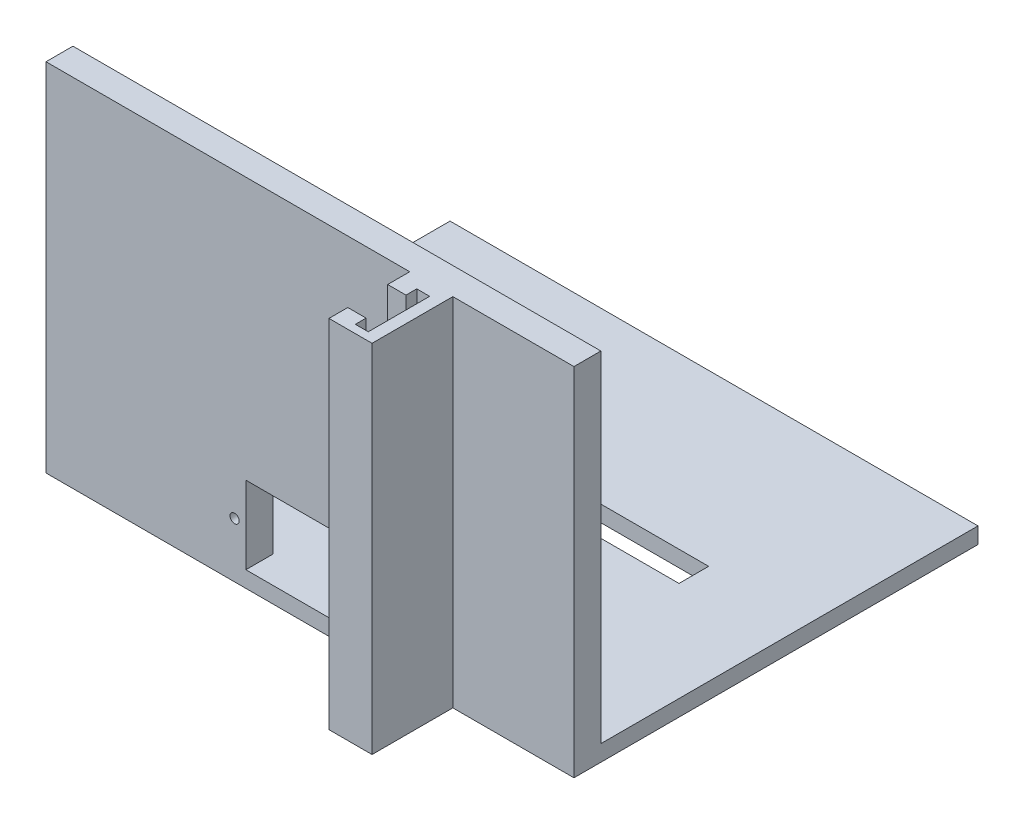
ISO-10303-21;
HEADER;
FILE_DESCRIPTION(('STEP AP214'),'2;1');
FILE_NAME('part.step','',(''),(''),'','','');
FILE_SCHEMA(('AUTOMOTIVE_DESIGN { 1 0 10303 214 1 1 1 1 }'));
ENDSEC;
DATA;
#1=APPLICATION_CONTEXT('core data for automotive mechanical design processes');
#2=APPLICATION_PROTOCOL_DEFINITION('international standard','automotive_design',2000,#1);
#3=PRODUCT_CONTEXT('',#1,'mechanical');
#4=PRODUCT('Part','Part','',(#3));
#5=PRODUCT_RELATED_PRODUCT_CATEGORY('part','',(#4));
#6=PRODUCT_DEFINITION_FORMATION('','',#4);
#7=PRODUCT_DEFINITION_CONTEXT('part definition',#1,'design');
#8=PRODUCT_DEFINITION('design','',#6,#7);
#9=PRODUCT_DEFINITION_SHAPE('','',#8);
#10=(LENGTH_UNIT() NAMED_UNIT(*) SI_UNIT(.MILLI.,.METRE.));
#11=(NAMED_UNIT(*) PLANE_ANGLE_UNIT() SI_UNIT($,.RADIAN.));
#12=(NAMED_UNIT(*) SI_UNIT($,.STERADIAN.) SOLID_ANGLE_UNIT());
#13=UNCERTAINTY_MEASURE_WITH_UNIT(LENGTH_MEASURE(1.E-05),#10,'distance_accuracy_value','');
#14=(GEOMETRIC_REPRESENTATION_CONTEXT(3) GLOBAL_UNCERTAINTY_ASSIGNED_CONTEXT((#13)) GLOBAL_UNIT_ASSIGNED_CONTEXT((#10,
#11,#12)) REPRESENTATION_CONTEXT('',''));
#15=CARTESIAN_POINT('',(0.,0.,0.));
#16=DIRECTION('',(0.,0.,1.));
#17=DIRECTION('',(1.,0.,0.));
#18=AXIS2_PLACEMENT_3D('',#15,#16,#17);
#19=CARTESIAN_POINT('',(0.,0.,5.));
#20=DIRECTION('',(0.,0.,1.));
#21=DIRECTION('',(1.,0.,0.));
#22=AXIS2_PLACEMENT_3D('',#19,#20,#21);
#23=PLANE('',#22);
#24=DIRECTION('',(0.,1.,0.));
#25=VECTOR('',#24,1.);
#26=CARTESIAN_POINT('',(26.52,55.9146124543355,5.));
#27=LINE('',#26,#25);
#28=CARTESIAN_POINT('',(26.52,-10.2,5.));
#29=VERTEX_POINT('',#28);
#30=CARTESIAN_POINT('',(26.52,55.9146124543355,5.));
#31=VERTEX_POINT('',#30);
#32=EDGE_CURVE('E47',#29,#31,#27,.T.);
#33=ORIENTED_EDGE('',*,*,#32,.F.);
#34=DIRECTION('',(1.,0.,0.));
#35=VECTOR('',#34,1.);
#36=CARTESIAN_POINT('',(-49.,-10.2,5.));
#37=LINE('',#36,#35);
#38=CARTESIAN_POINT('',(49.,-10.2,5.));
#39=VERTEX_POINT('',#38);
#40=EDGE_CURVE('E283',#29,#39,#37,.T.);
#41=ORIENTED_EDGE('',*,*,#40,.T.);
#42=DIRECTION('',(0.,1.,0.));
#43=VECTOR('',#42,1.);
#44=CARTESIAN_POINT('',(49.,55.9146124543355,5.));
#45=LINE('',#44,#43);
#46=CARTESIAN_POINT('',(49.,55.9146124543355,5.));
#47=VERTEX_POINT('',#46);
#48=EDGE_CURVE('E370',#39,#47,#45,.T.);
#49=ORIENTED_EDGE('',*,*,#48,.T.);
#50=DIRECTION('',(-1.,0.,0.));
#51=VECTOR('',#50,1.);
#52=CARTESIAN_POINT('',(-49.,55.9146124543355,5.));
#53=LINE('',#52,#51);
#54=EDGE_CURVE('E374',#47,#31,#53,.T.);
#55=ORIENTED_EDGE('',*,*,#54,.T.);
#56=EDGE_LOOP('',(#33,#41,#49,#55));
#57=FACE_BOUND('',#56,.T.);
#58=ADVANCED_FACE('F32',(#57),#23,.T.);
#59=CARTESIAN_POINT('',(-14.,0.,5.));
#60=DIRECTION('',(0.,0.,1.));
#61=DIRECTION('',(1.,0.,0.));
#62=AXIS2_PLACEMENT_3D('',#59,#60,#61);
#63=CIRCLE('',#62,0.849999999999992);
#64=CARTESIAN_POINT('',(-13.15,0.,5.));
#65=VERTEX_POINT('',#64);
#66=EDGE_CURVE('E336',#65,#65,#63,.T.);
#67=ORIENTED_EDGE('',*,*,#66,.F.);
#68=EDGE_LOOP('',(#67));
#69=FACE_BOUND('',#68,.T.);
#70=DIRECTION('',(-1.,0.,0.));
#71=VECTOR('',#70,1.);
#72=CARTESIAN_POINT('',(-11.9,7.2,5.));
#73=LINE('',#72,#71);
#74=CARTESIAN_POINT('',(11.9,7.2,5.));
#75=VERTEX_POINT('',#74);
#76=CARTESIAN_POINT('',(-11.9,7.2,5.));
#77=VERTEX_POINT('',#76);
#78=EDGE_CURVE('E344',#75,#77,#73,.T.);
#79=ORIENTED_EDGE('',*,*,#78,.F.);
#80=DIRECTION('',(0.,1.,0.));
#81=VECTOR('',#80,1.);
#82=CARTESIAN_POINT('',(11.9,7.2,5.));
#83=LINE('',#82,#81);
#84=CARTESIAN_POINT('',(11.9,-7.2,5.));
#85=VERTEX_POINT('',#84);
#86=EDGE_CURVE('E342',#85,#75,#83,.T.);
#87=ORIENTED_EDGE('',*,*,#86,.F.);
#88=DIRECTION('',(1.,0.,0.));
#89=VECTOR('',#88,1.);
#90=CARTESIAN_POINT('',(-11.9,-7.2,5.));
#91=LINE('',#90,#89);
#92=CARTESIAN_POINT('',(-11.9,-7.2,5.));
#93=VERTEX_POINT('',#92);
#94=EDGE_CURVE('E350',#93,#85,#91,.T.);
#95=ORIENTED_EDGE('',*,*,#94,.F.);
#96=DIRECTION('',(0.,-1.,0.));
#97=VECTOR('',#96,1.);
#98=CARTESIAN_POINT('',(-11.9,7.2,5.));
#99=LINE('',#98,#97);
#100=EDGE_CURVE('E347',#77,#93,#99,.T.);
#101=ORIENTED_EDGE('',*,*,#100,.F.);
#102=EDGE_LOOP('',(#79,#87,#95,#101));
#103=FACE_BOUND('',#102,.T.);
#104=CARTESIAN_POINT('',(14.,0.,5.));
#105=DIRECTION('',(0.,0.,1.));
#106=DIRECTION('',(1.,0.,0.));
#107=AXIS2_PLACEMENT_3D('',#104,#105,#106);
#108=CIRCLE('',#107,0.85);
#109=CARTESIAN_POINT('',(14.85,0.,5.));
#110=VERTEX_POINT('',#109);
#111=EDGE_CURVE('E330',#110,#110,#108,.T.);
#112=ORIENTED_EDGE('',*,*,#111,.F.);
#113=EDGE_LOOP('',(#112));
#114=FACE_BOUND('',#113,.T.);
#115=CARTESIAN_POINT('',(-49.,-10.1999999999999,5.));
#116=VERTEX_POINT('',#115);
#117=CARTESIAN_POINT('',(18.52,-10.2,5.));
#118=VERTEX_POINT('',#117);
#119=EDGE_CURVE('E284',#116,#118,#37,.T.);
#120=ORIENTED_EDGE('',*,*,#119,.T.);
#121=DIRECTION('',(0.,-1.,0.));
#122=VECTOR('',#121,1.);
#123=CARTESIAN_POINT('',(18.52,55.9146124543355,5.));
#124=LINE('',#123,#122);
#125=CARTESIAN_POINT('',(18.52,55.9146124543355,5.));
#126=VERTEX_POINT('',#125);
#127=EDGE_CURVE('E55',#126,#118,#124,.T.);
#128=ORIENTED_EDGE('',*,*,#127,.F.);
#129=CARTESIAN_POINT('',(-49.,55.9146124543355,5.));
#130=VERTEX_POINT('',#129);
#131=EDGE_CURVE('E372',#126,#130,#53,.T.);
#132=ORIENTED_EDGE('',*,*,#131,.T.);
#133=DIRECTION('',(0.,-1.,0.));
#134=VECTOR('',#133,1.);
#135=CARTESIAN_POINT('',(-49.,55.9146124543355,5.));
#136=LINE('',#135,#134);
#137=EDGE_CURVE('E376',#130,#116,#136,.T.);
#138=ORIENTED_EDGE('',*,*,#137,.T.);
#139=EDGE_LOOP('',(#120,#128,#132,#138));
#140=FACE_BOUND('',#139,.T.);
#141=ADVANCED_FACE('F429',(#69,#103,#114,#140),#23,.T.);
#142=CARTESIAN_POINT('',(18.52,55.9146124543355,20.));
#143=DIRECTION('',(1.,0.,0.));
#144=DIRECTION('',(0.,1.,0.));
#145=AXIS2_PLACEMENT_3D('',#142,#143,#144);
#146=PLANE('',#145);
#147=ORIENTED_EDGE('',*,*,#127,.T.);
#148=DIRECTION('',(0.,0.,1.));
#149=VECTOR('',#148,1.);
#150=CARTESIAN_POINT('',(18.52,-10.2,9.1));
#151=LINE('',#150,#149);
#152=CARTESIAN_POINT('',(18.52,-10.2,9.1));
#153=VERTEX_POINT('',#152);
#154=EDGE_CURVE('E465',#118,#153,#151,.T.);
#155=ORIENTED_EDGE('',*,*,#154,.T.);
#156=DIRECTION('',(0.,1.,0.));
#157=VECTOR('',#156,1.);
#158=CARTESIAN_POINT('',(18.52,-10.2,9.1));
#159=LINE('',#158,#157);
#160=CARTESIAN_POINT('',(18.52,55.9146124543355,9.1));
#161=VERTEX_POINT('',#160);
#162=EDGE_CURVE('E255',#153,#161,#159,.T.);
#163=ORIENTED_EDGE('',*,*,#162,.T.);
#164=DIRECTION('',(0.,0.,-1.));
#165=VECTOR('',#164,1.);
#166=CARTESIAN_POINT('',(18.52,55.9146124543355,20.));
#167=LINE('',#166,#165);
#168=EDGE_CURVE('E274',#161,#126,#167,.T.);
#169=ORIENTED_EDGE('',*,*,#168,.T.);
#170=EDGE_LOOP('',(#147,#155,#163,#169));
#171=FACE_BOUND('',#170,.T.);
#172=ADVANCED_FACE('F434',(#171),#146,.F.);
#173=CARTESIAN_POINT('',(0.,0.,0.));
#174=DIRECTION('',(0.,0.,1.));
#175=DIRECTION('',(1.,0.,0.));
#176=AXIS2_PLACEMENT_3D('',#173,#174,#175);
#177=PLANE('',#176);
#178=CARTESIAN_POINT('',(14.,0.,0.));
#179=DIRECTION('',(0.,0.,1.));
#180=DIRECTION('',(1.,0.,0.));
#181=AXIS2_PLACEMENT_3D('',#178,#179,#180);
#182=CIRCLE('',#181,0.85);
#183=CARTESIAN_POINT('',(14.85,0.,0.));
#184=VERTEX_POINT('',#183);
#185=EDGE_CURVE('E329',#184,#184,#182,.T.);
#186=ORIENTED_EDGE('',*,*,#185,.T.);
#187=EDGE_LOOP('',(#186));
#188=FACE_BOUND('',#187,.T.);
#189=CARTESIAN_POINT('',(-14.,0.,0.));
#190=DIRECTION('',(0.,0.,1.));
#191=DIRECTION('',(1.,0.,0.));
#192=AXIS2_PLACEMENT_3D('',#189,#190,#191);
#193=CIRCLE('',#192,0.849999999999992);
#194=CARTESIAN_POINT('',(-13.15,0.,0.));
#195=VERTEX_POINT('',#194);
#196=EDGE_CURVE('E333',#195,#195,#193,.T.);
#197=ORIENTED_EDGE('',*,*,#196,.T.);
#198=EDGE_LOOP('',(#197));
#199=FACE_BOUND('',#198,.T.);
#200=DIRECTION('',(1.,0.,0.));
#201=VECTOR('',#200,1.);
#202=CARTESIAN_POINT('',(49.,-7.2,0.));
#203=LINE('',#202,#201);
#204=CARTESIAN_POINT('',(-49.,-7.19999999999997,0.));
#205=VERTEX_POINT('',#204);
#206=CARTESIAN_POINT('',(-11.9,-7.2,0.));
#207=VERTEX_POINT('',#206);
#208=EDGE_CURVE('E300',#205,#207,#203,.T.);
#209=ORIENTED_EDGE('',*,*,#208,.F.);
#210=DIRECTION('',(0.,-1.,0.));
#211=VECTOR('',#210,1.);
#212=CARTESIAN_POINT('',(-49.,55.9146124543355,0.));
#213=LINE('',#212,#211);
#214=CARTESIAN_POINT('',(-49.,55.9146124543355,0.));
#215=VERTEX_POINT('',#214);
#216=EDGE_CURVE('E373',#215,#205,#213,.T.);
#217=ORIENTED_EDGE('',*,*,#216,.F.);
#218=DIRECTION('',(-1.,0.,0.));
#219=VECTOR('',#218,1.);
#220=CARTESIAN_POINT('',(-49.,55.9146124543355,0.));
#221=LINE('',#220,#219);
#222=CARTESIAN_POINT('',(49.,55.9146124543355,0.));
#223=VERTEX_POINT('',#222);
#224=EDGE_CURVE('E381',#223,#215,#221,.T.);
#225=ORIENTED_EDGE('',*,*,#224,.F.);
#226=DIRECTION('',(0.,1.,0.));
#227=VECTOR('',#226,1.);
#228=CARTESIAN_POINT('',(49.,55.9146124543355,0.));
#229=LINE('',#228,#227);
#230=CARTESIAN_POINT('',(49.,-7.2,0.));
#231=VERTEX_POINT('',#230);
#232=EDGE_CURVE('E369',#231,#223,#229,.T.);
#233=ORIENTED_EDGE('',*,*,#232,.F.);
#234=CARTESIAN_POINT('',(11.9,-7.2,0.));
#235=VERTEX_POINT('',#234);
#236=EDGE_CURVE('E319',#235,#231,#203,.T.);
#237=ORIENTED_EDGE('',*,*,#236,.F.);
#238=DIRECTION('',(0.,1.,0.));
#239=VECTOR('',#238,1.);
#240=CARTESIAN_POINT('',(11.9,7.2,0.));
#241=LINE('',#240,#239);
#242=CARTESIAN_POINT('',(11.9,7.2,0.));
#243=VERTEX_POINT('',#242);
#244=EDGE_CURVE('E339',#235,#243,#241,.T.);
#245=ORIENTED_EDGE('',*,*,#244,.T.);
#246=DIRECTION('',(-1.,0.,0.));
#247=VECTOR('',#246,1.);
#248=CARTESIAN_POINT('',(-11.9,7.2,0.));
#249=LINE('',#248,#247);
#250=CARTESIAN_POINT('',(-11.9,7.2,0.));
#251=VERTEX_POINT('',#250);
#252=EDGE_CURVE('E355',#243,#251,#249,.T.);
#253=ORIENTED_EDGE('',*,*,#252,.T.);
#254=DIRECTION('',(0.,-1.,0.));
#255=VECTOR('',#254,1.);
#256=CARTESIAN_POINT('',(-11.9,7.2,0.));
#257=LINE('',#256,#255);
#258=EDGE_CURVE('E345',#251,#207,#257,.T.);
#259=ORIENTED_EDGE('',*,*,#258,.T.);
#260=EDGE_LOOP('',(#209,#217,#225,#233,#237,#245,#253,#259));
#261=FACE_BOUND('',#260,.T.);
#262=ADVANCED_FACE('F440',(#188,#199,#261),#177,.F.);
#263=CARTESIAN_POINT('',(49.,55.9146124543355,5.));
#264=DIRECTION('',(-1.,0.,0.));
#265=DIRECTION('',(0.,0.,1.));
#266=AXIS2_PLACEMENT_3D('',#263,#264,#265);
#267=PLANE('',#266);
#268=ORIENTED_EDGE('',*,*,#48,.F.);
#269=DIRECTION('',(0.,0.,1.));
#270=VECTOR('',#269,1.);
#271=CARTESIAN_POINT('',(49.,-10.2,-70.));
#272=LINE('',#271,#270);
#273=CARTESIAN_POINT('',(49.,-10.2,-70.));
#274=VERTEX_POINT('',#273);
#275=EDGE_CURVE('E321',#274,#39,#272,.T.);
#276=ORIENTED_EDGE('',*,*,#275,.F.);
#277=DIRECTION('',(0.,-1.,0.));
#278=VECTOR('',#277,1.);
#279=CARTESIAN_POINT('',(49.,-10.2,-70.));
#280=LINE('',#279,#278);
#281=CARTESIAN_POINT('',(49.,-7.2,-70.));
#282=VERTEX_POINT('',#281);
#283=EDGE_CURVE('E312',#282,#274,#280,.T.);
#284=ORIENTED_EDGE('',*,*,#283,.F.);
#285=DIRECTION('',(0.,0.,1.));
#286=VECTOR('',#285,1.);
#287=CARTESIAN_POINT('',(49.,-7.2,-70.));
#288=LINE('',#287,#286);
#289=EDGE_CURVE('E323',#282,#231,#288,.T.);
#290=ORIENTED_EDGE('',*,*,#289,.T.);
#291=ORIENTED_EDGE('',*,*,#232,.T.);
#292=DIRECTION('',(0.,0.,-1.));
#293=VECTOR('',#292,1.);
#294=CARTESIAN_POINT('',(49.,55.9146124543355,5.));
#295=LINE('',#294,#293);
#296=EDGE_CURVE('E387',#47,#223,#295,.T.);
#297=ORIENTED_EDGE('',*,*,#296,.F.);
#298=EDGE_LOOP('',(#268,#276,#284,#290,#291,#297));
#299=FACE_BOUND('',#298,.T.);
#300=ADVANCED_FACE('F34',(#299),#267,.F.);
#301=CARTESIAN_POINT('',(-49.,55.9146124543355,5.));
#302=DIRECTION('',(0.,-1.,0.));
#303=DIRECTION('',(0.,0.,-1.));
#304=AXIS2_PLACEMENT_3D('',#301,#302,#303);
#305=PLANE('',#304);
#306=ORIENTED_EDGE('',*,*,#168,.F.);
#307=DIRECTION('',(-1.,0.,0.));
#308=VECTOR('',#307,1.);
#309=CARTESIAN_POINT('',(18.52,55.9146124543355,9.1));
#310=LINE('',#309,#308);
#311=CARTESIAN_POINT('',(21.92,55.9146124543355,9.1));
#312=VERTEX_POINT('',#311);
#313=EDGE_CURVE('E252',#312,#161,#310,.T.);
#314=ORIENTED_EDGE('',*,*,#313,.F.);
#315=DIRECTION('',(0.,0.,1.));
#316=VECTOR('',#315,1.);
#317=CARTESIAN_POINT('',(21.92,55.9146124543355,9.1));
#318=LINE('',#317,#316);
#319=CARTESIAN_POINT('',(21.92,55.9146124543355,7.1));
#320=VERTEX_POINT('',#319);
#321=EDGE_CURVE('E249',#320,#312,#318,.T.);
#322=ORIENTED_EDGE('',*,*,#321,.F.);
#323=DIRECTION('',(-1.,0.,0.));
#324=VECTOR('',#323,1.);
#325=CARTESIAN_POINT('',(21.92,55.9146124543355,7.1));
#326=LINE('',#325,#324);
#327=CARTESIAN_POINT('',(24.32,55.9146124543355,7.1));
#328=VERTEX_POINT('',#327);
#329=EDGE_CURVE('E246',#328,#320,#326,.T.);
#330=ORIENTED_EDGE('',*,*,#329,.F.);
#331=DIRECTION('',(0.,0.,-1.));
#332=VECTOR('',#331,1.);
#333=CARTESIAN_POINT('',(24.32,55.9146124543355,7.1));
#334=LINE('',#333,#332);
#335=CARTESIAN_POINT('',(24.32,55.9146124543355,18.5));
#336=VERTEX_POINT('',#335);
#337=EDGE_CURVE('E244',#336,#328,#334,.T.);
#338=ORIENTED_EDGE('',*,*,#337,.F.);
#339=DIRECTION('',(1.,0.,0.));
#340=VECTOR('',#339,1.);
#341=CARTESIAN_POINT('',(24.32,55.9146124543355,18.5));
#342=LINE('',#341,#340);
#343=CARTESIAN_POINT('',(21.92,55.9146124543355,18.5));
#344=VERTEX_POINT('',#343);
#345=EDGE_CURVE('E211',#344,#336,#342,.T.);
#346=ORIENTED_EDGE('',*,*,#345,.F.);
#347=DIRECTION('',(0.,0.,1.));
#348=VECTOR('',#347,1.);
#349=CARTESIAN_POINT('',(21.92,55.9146124543355,18.5));
#350=LINE('',#349,#348);
#351=CARTESIAN_POINT('',(21.92,55.9146124543355,16.5));
#352=VERTEX_POINT('',#351);
#353=EDGE_CURVE('E240',#352,#344,#350,.T.);
#354=ORIENTED_EDGE('',*,*,#353,.F.);
#355=DIRECTION('',(1.,0.,0.));
#356=VECTOR('',#355,1.);
#357=CARTESIAN_POINT('',(21.92,55.9146124543355,16.5));
#358=LINE('',#357,#356);
#359=CARTESIAN_POINT('',(18.52,55.9146124543355,16.5));
#360=VERTEX_POINT('',#359);
#361=EDGE_CURVE('E237',#360,#352,#358,.T.);
#362=ORIENTED_EDGE('',*,*,#361,.F.);
#363=CARTESIAN_POINT('',(18.52,55.9146124543355,20.));
#364=VERTEX_POINT('',#363);
#365=EDGE_CURVE('E277',#364,#360,#167,.T.);
#366=ORIENTED_EDGE('',*,*,#365,.F.);
#367=DIRECTION('',(-1.,0.,0.));
#368=VECTOR('',#367,1.);
#369=CARTESIAN_POINT('',(18.52,55.9146124543355,20.));
#370=LINE('',#369,#368);
#371=CARTESIAN_POINT('',(26.52,55.9146124543355,20.));
#372=VERTEX_POINT('',#371);
#373=EDGE_CURVE('E270',#372,#364,#370,.T.);
#374=ORIENTED_EDGE('',*,*,#373,.F.);
#375=DIRECTION('',(0.,0.,-1.));
#376=VECTOR('',#375,1.);
#377=CARTESIAN_POINT('',(26.52,55.9146124543355,20.));
#378=LINE('',#377,#376);
#379=EDGE_CURVE('E280',#372,#31,#378,.T.);
#380=ORIENTED_EDGE('',*,*,#379,.T.);
#381=ORIENTED_EDGE('',*,*,#54,.F.);
#382=ORIENTED_EDGE('',*,*,#296,.T.);
#383=ORIENTED_EDGE('',*,*,#224,.T.);
#384=DIRECTION('',(0.,0.,-1.));
#385=VECTOR('',#384,1.);
#386=CARTESIAN_POINT('',(-49.,55.9146124543355,5.));
#387=LINE('',#386,#385);
#388=EDGE_CURVE('E379',#130,#215,#387,.T.);
#389=ORIENTED_EDGE('',*,*,#388,.F.);
#390=ORIENTED_EDGE('',*,*,#131,.F.);
#391=EDGE_LOOP('',(#306,#314,#322,#330,#338,#346,#354,#362,#366,#374,#380,#381,#382,#383,#389,#390));
#392=FACE_BOUND('',#391,.T.);
#393=ADVANCED_FACE('F446',(#392),#305,.F.);
#394=CARTESIAN_POINT('',(-49.,55.9146124543355,5.));
#395=DIRECTION('',(1.,0.,0.));
#396=DIRECTION('',(0.,0.,-1.));
#397=AXIS2_PLACEMENT_3D('',#394,#395,#396);
#398=PLANE('',#397);
#399=DIRECTION('',(0.,0.,1.));
#400=VECTOR('',#399,1.);
#401=CARTESIAN_POINT('',(-49.,-10.2,-70.));
#402=LINE('',#401,#400);
#403=CARTESIAN_POINT('',(-49.,-10.2,-70.));
#404=VERTEX_POINT('',#403);
#405=EDGE_CURVE('E316',#404,#116,#402,.T.);
#406=ORIENTED_EDGE('',*,*,#405,.T.);
#407=ORIENTED_EDGE('',*,*,#137,.F.);
#408=ORIENTED_EDGE('',*,*,#388,.T.);
#409=ORIENTED_EDGE('',*,*,#216,.T.);
#410=DIRECTION('',(0.,0.,1.));
#411=VECTOR('',#410,1.);
#412=CARTESIAN_POINT('',(-49.,-7.2,-70.));
#413=LINE('',#412,#411);
#414=CARTESIAN_POINT('',(-49.,-7.2,-70.));
#415=VERTEX_POINT('',#414);
#416=EDGE_CURVE('E326',#415,#205,#413,.T.);
#417=ORIENTED_EDGE('',*,*,#416,.F.);
#418=DIRECTION('',(0.,1.,0.));
#419=VECTOR('',#418,1.);
#420=CARTESIAN_POINT('',(-49.,-10.2,-70.));
#421=LINE('',#420,#419);
#422=EDGE_CURVE('E307',#404,#415,#421,.T.);
#423=ORIENTED_EDGE('',*,*,#422,.F.);
#424=EDGE_LOOP('',(#406,#407,#408,#409,#417,#423));
#425=FACE_BOUND('',#424,.T.);
#426=ADVANCED_FACE('F444',(#425),#398,.F.);
#427=CARTESIAN_POINT('',(11.9,7.2,5.));
#428=DIRECTION('',(-1.,0.,0.));
#429=DIRECTION('',(0.,0.,1.));
#430=AXIS2_PLACEMENT_3D('',#427,#428,#429);
#431=PLANE('',#430);
#432=ORIENTED_EDGE('',*,*,#244,.F.);
#433=DIRECTION('',(0.,0.,-1.));
#434=VECTOR('',#433,1.);
#435=CARTESIAN_POINT('',(11.9,-7.2,5.));
#436=LINE('',#435,#434);
#437=EDGE_CURVE('E352',#85,#235,#436,.T.);
#438=ORIENTED_EDGE('',*,*,#437,.F.);
#439=ORIENTED_EDGE('',*,*,#86,.T.);
#440=DIRECTION('',(0.,0.,-1.));
#441=VECTOR('',#440,1.);
#442=CARTESIAN_POINT('',(11.9,7.2,5.));
#443=LINE('',#442,#441);
#444=EDGE_CURVE('E366',#75,#243,#443,.T.);
#445=ORIENTED_EDGE('',*,*,#444,.T.);
#446=EDGE_LOOP('',(#432,#438,#439,#445));
#447=FACE_BOUND('',#446,.T.);
#448=ADVANCED_FACE('F438',(#447),#431,.T.);
#449=CARTESIAN_POINT('',(-11.9,7.2,5.));
#450=DIRECTION('',(0.,-1.,0.));
#451=DIRECTION('',(0.,0.,-1.));
#452=AXIS2_PLACEMENT_3D('',#449,#450,#451);
#453=PLANE('',#452);
#454=ORIENTED_EDGE('',*,*,#252,.F.);
#455=ORIENTED_EDGE('',*,*,#444,.F.);
#456=ORIENTED_EDGE('',*,*,#78,.T.);
#457=DIRECTION('',(0.,0.,-1.));
#458=VECTOR('',#457,1.);
#459=CARTESIAN_POINT('',(-11.9,7.2,5.));
#460=LINE('',#459,#458);
#461=EDGE_CURVE('E364',#77,#251,#460,.T.);
#462=ORIENTED_EDGE('',*,*,#461,.T.);
#463=EDGE_LOOP('',(#454,#455,#456,#462));
#464=FACE_BOUND('',#463,.T.);
#465=ADVANCED_FACE('F531',(#464),#453,.T.);
#466=CARTESIAN_POINT('',(-11.9,7.2,5.));
#467=DIRECTION('',(1.,0.,0.));
#468=DIRECTION('',(0.,0.,-1.));
#469=AXIS2_PLACEMENT_3D('',#466,#467,#468);
#470=PLANE('',#469);
#471=ORIENTED_EDGE('',*,*,#258,.F.);
#472=ORIENTED_EDGE('',*,*,#461,.F.);
#473=ORIENTED_EDGE('',*,*,#100,.T.);
#474=DIRECTION('',(0.,0.,-1.));
#475=VECTOR('',#474,1.);
#476=CARTESIAN_POINT('',(-11.9,-7.2,5.));
#477=LINE('',#476,#475);
#478=EDGE_CURVE('E362',#93,#207,#477,.T.);
#479=ORIENTED_EDGE('',*,*,#478,.T.);
#480=EDGE_LOOP('',(#471,#472,#473,#479));
#481=FACE_BOUND('',#480,.T.);
#482=ADVANCED_FACE('F538',(#481),#470,.T.);
#483=CARTESIAN_POINT('',(-11.9,-7.2,5.));
#484=DIRECTION('',(0.,1.,0.));
#485=DIRECTION('',(0.,0.,1.));
#486=AXIS2_PLACEMENT_3D('',#483,#484,#485);
#487=PLANE('',#486);
#488=DIRECTION('',(0.,0.,1.));
#489=VECTOR('',#488,1.);
#490=CARTESIAN_POINT('',(-30.5,-7.2,-33.));
#491=LINE('',#490,#489);
#492=CARTESIAN_POINT('',(-30.5,-7.2,-38.5));
#493=VERTEX_POINT('',#492);
#494=CARTESIAN_POINT('',(-30.5,-7.2,-33.));
#495=VERTEX_POINT('',#494);
#496=EDGE_CURVE('E286',#493,#495,#491,.T.);
#497=ORIENTED_EDGE('',*,*,#496,.F.);
#498=DIRECTION('',(-1.,0.,0.));
#499=VECTOR('',#498,1.);
#500=CARTESIAN_POINT('',(30.5,-7.2,-38.5));
#501=LINE('',#500,#499);
#502=CARTESIAN_POINT('',(30.5,-7.2,-38.5));
#503=VERTEX_POINT('',#502);
#504=EDGE_CURVE('E294',#503,#493,#501,.T.);
#505=ORIENTED_EDGE('',*,*,#504,.F.);
#506=DIRECTION('',(0.,0.,-1.));
#507=VECTOR('',#506,1.);
#508=CARTESIAN_POINT('',(30.5,-7.2,-33.));
#509=LINE('',#508,#507);
#510=CARTESIAN_POINT('',(30.5,-7.2,-33.));
#511=VERTEX_POINT('',#510);
#512=EDGE_CURVE('E291',#511,#503,#509,.T.);
#513=ORIENTED_EDGE('',*,*,#512,.F.);
#514=DIRECTION('',(1.,0.,0.));
#515=VECTOR('',#514,1.);
#516=CARTESIAN_POINT('',(30.5,-7.2,-33.));
#517=LINE('',#516,#515);
#518=EDGE_CURVE('E288',#495,#511,#517,.T.);
#519=ORIENTED_EDGE('',*,*,#518,.F.);
#520=EDGE_LOOP('',(#497,#505,#513,#519));
#521=FACE_BOUND('',#520,.T.);
#522=ORIENTED_EDGE('',*,*,#437,.T.);
#523=ORIENTED_EDGE('',*,*,#236,.T.);
#524=ORIENTED_EDGE('',*,*,#289,.F.);
#525=DIRECTION('',(1.,0.,0.));
#526=VECTOR('',#525,1.);
#527=CARTESIAN_POINT('',(49.,-7.2,-70.));
#528=LINE('',#527,#526);
#529=EDGE_CURVE('E310',#415,#282,#528,.T.);
#530=ORIENTED_EDGE('',*,*,#529,.F.);
#531=ORIENTED_EDGE('',*,*,#416,.T.);
#532=ORIENTED_EDGE('',*,*,#208,.T.);
#533=ORIENTED_EDGE('',*,*,#478,.F.);
#534=ORIENTED_EDGE('',*,*,#94,.T.);
#535=EDGE_LOOP('',(#522,#523,#524,#530,#531,#532,#533,#534));
#536=FACE_BOUND('',#535,.T.);
#537=ADVANCED_FACE('F409',(#521,#536),#487,.T.);
#538=CARTESIAN_POINT('',(-14.,0.,5.));
#539=DIRECTION('',(0.,0.,-1.));
#540=DIRECTION('',(-1.,0.,0.));
#541=AXIS2_PLACEMENT_3D('',#538,#539,#540);
#542=CYLINDRICAL_SURFACE('',#541,0.849999999999992);
#543=ORIENTED_EDGE('',*,*,#66,.T.);
#544=EDGE_LOOP('',(#543));
#545=FACE_BOUND('',#544,.T.);
#546=ORIENTED_EDGE('',*,*,#196,.F.);
#547=EDGE_LOOP('',(#546));
#548=FACE_BOUND('',#547,.T.);
#549=ADVANCED_FACE('F545',(#545,#548),#542,.F.);
#550=CARTESIAN_POINT('',(14.,0.,5.));
#551=DIRECTION('',(0.,0.,-1.));
#552=DIRECTION('',(-1.,0.,0.));
#553=AXIS2_PLACEMENT_3D('',#550,#551,#552);
#554=CYLINDRICAL_SURFACE('',#553,0.85);
#555=ORIENTED_EDGE('',*,*,#111,.T.);
#556=EDGE_LOOP('',(#555));
#557=FACE_BOUND('',#556,.T.);
#558=ORIENTED_EDGE('',*,*,#185,.F.);
#559=EDGE_LOOP('',(#558));
#560=FACE_BOUND('',#559,.T.);
#561=ADVANCED_FACE('F550',(#557,#560),#554,.F.);
#562=CARTESIAN_POINT('',(49.,-10.2,-70.));
#563=DIRECTION('',(0.,1.,0.));
#564=DIRECTION('',(0.,0.,1.));
#565=AXIS2_PLACEMENT_3D('',#562,#563,#564);
#566=PLANE('',#565);
#567=DIRECTION('',(-1.,0.,0.));
#568=VECTOR('',#567,1.);
#569=CARTESIAN_POINT('',(49.,-10.2,-38.5));
#570=LINE('',#569,#568);
#571=CARTESIAN_POINT('',(30.5,-10.2,-38.5));
#572=VERTEX_POINT('',#571);
#573=CARTESIAN_POINT('',(-30.5,-10.2,-38.5));
#574=VERTEX_POINT('',#573);
#575=EDGE_CURVE('E40',#572,#574,#570,.T.);
#576=ORIENTED_EDGE('',*,*,#575,.T.);
#577=DIRECTION('',(0.,0.,1.));
#578=VECTOR('',#577,1.);
#579=CARTESIAN_POINT('',(-30.5,-10.2,-70.));
#580=LINE('',#579,#578);
#581=CARTESIAN_POINT('',(-30.5,-10.2,-33.));
#582=VERTEX_POINT('',#581);
#583=EDGE_CURVE('E11',#574,#582,#580,.T.);
#584=ORIENTED_EDGE('',*,*,#583,.T.);
#585=DIRECTION('',(1.,0.,0.));
#586=VECTOR('',#585,1.);
#587=CARTESIAN_POINT('',(49.,-10.2,-33.));
#588=LINE('',#587,#586);
#589=CARTESIAN_POINT('',(30.5,-10.2,-33.));
#590=VERTEX_POINT('',#589);
#591=EDGE_CURVE('E390',#582,#590,#588,.T.);
#592=ORIENTED_EDGE('',*,*,#591,.T.);
#593=DIRECTION('',(0.,0.,-1.));
#594=VECTOR('',#593,1.);
#595=CARTESIAN_POINT('',(30.5,-10.2,-70.));
#596=LINE('',#595,#594);
#597=EDGE_CURVE('E393',#590,#572,#596,.T.);
#598=ORIENTED_EDGE('',*,*,#597,.T.);
#599=EDGE_LOOP('',(#576,#584,#592,#598));
#600=FACE_BOUND('',#599,.T.);
#601=ORIENTED_EDGE('',*,*,#275,.T.);
#602=ORIENTED_EDGE('',*,*,#40,.F.);
#603=DIRECTION('',(0.,0.,-1.));
#604=VECTOR('',#603,1.);
#605=CARTESIAN_POINT('',(26.52,-10.2,5.));
#606=LINE('',#605,#604);
#607=CARTESIAN_POINT('',(26.52,-10.2,20.));
#608=VERTEX_POINT('',#607);
#609=EDGE_CURVE('E469',#608,#29,#606,.T.);
#610=ORIENTED_EDGE('',*,*,#609,.F.);
#611=DIRECTION('',(1.,0.,0.));
#612=VECTOR('',#611,1.);
#613=CARTESIAN_POINT('',(26.52,-10.2,20.));
#614=LINE('',#613,#612);
#615=CARTESIAN_POINT('',(18.52,-10.2,20.));
#616=VERTEX_POINT('',#615);
#617=EDGE_CURVE('E474',#616,#608,#614,.T.);
#618=ORIENTED_EDGE('',*,*,#617,.F.);
#619=DIRECTION('',(0.,0.,1.));
#620=VECTOR('',#619,1.);
#621=CARTESIAN_POINT('',(18.52,-10.2,20.));
#622=LINE('',#621,#620);
#623=CARTESIAN_POINT('',(18.52,-10.2,16.5));
#624=VERTEX_POINT('',#623);
#625=EDGE_CURVE('E498',#624,#616,#622,.T.);
#626=ORIENTED_EDGE('',*,*,#625,.F.);
#627=DIRECTION('',(-1.,0.,0.));
#628=VECTOR('',#627,1.);
#629=CARTESIAN_POINT('',(18.52,-10.2,16.5));
#630=LINE('',#629,#628);
#631=CARTESIAN_POINT('',(21.92,-10.2,16.5));
#632=VERTEX_POINT('',#631);
#633=EDGE_CURVE('E493',#632,#624,#630,.T.);
#634=ORIENTED_EDGE('',*,*,#633,.F.);
#635=DIRECTION('',(0.,0.,-1.));
#636=VECTOR('',#635,1.);
#637=CARTESIAN_POINT('',(21.92,-10.2,16.5));
#638=LINE('',#637,#636);
#639=CARTESIAN_POINT('',(21.92,-10.2,18.5));
#640=VERTEX_POINT('',#639);
#641=EDGE_CURVE('E229',#640,#632,#638,.T.);
#642=ORIENTED_EDGE('',*,*,#641,.F.);
#643=DIRECTION('',(-1.,0.,0.));
#644=VECTOR('',#643,1.);
#645=CARTESIAN_POINT('',(21.92,-10.2,18.5));
#646=LINE('',#645,#644);
#647=CARTESIAN_POINT('',(24.32,-10.2,18.5));
#648=VERTEX_POINT('',#647);
#649=EDGE_CURVE('E209',#648,#640,#646,.T.);
#650=ORIENTED_EDGE('',*,*,#649,.F.);
#651=DIRECTION('',(0.,0.,1.));
#652=VECTOR('',#651,1.);
#653=CARTESIAN_POINT('',(24.32,-10.2,18.5));
#654=LINE('',#653,#652);
#655=CARTESIAN_POINT('',(24.32,-10.2,7.1));
#656=VERTEX_POINT('',#655);
#657=EDGE_CURVE('E225',#656,#648,#654,.T.);
#658=ORIENTED_EDGE('',*,*,#657,.F.);
#659=DIRECTION('',(1.,0.,0.));
#660=VECTOR('',#659,1.);
#661=CARTESIAN_POINT('',(24.32,-10.2,7.1));
#662=LINE('',#661,#660);
#663=CARTESIAN_POINT('',(21.92,-10.2,7.1));
#664=VERTEX_POINT('',#663);
#665=EDGE_CURVE('E235',#664,#656,#662,.T.);
#666=ORIENTED_EDGE('',*,*,#665,.F.);
#667=DIRECTION('',(0.,0.,-1.));
#668=VECTOR('',#667,1.);
#669=CARTESIAN_POINT('',(21.92,-10.2,7.1));
#670=LINE('',#669,#668);
#671=CARTESIAN_POINT('',(21.92,-10.2,9.1));
#672=VERTEX_POINT('',#671);
#673=EDGE_CURVE('E471',#672,#664,#670,.T.);
#674=ORIENTED_EDGE('',*,*,#673,.F.);
#675=DIRECTION('',(1.,0.,0.));
#676=VECTOR('',#675,1.);
#677=CARTESIAN_POINT('',(21.92,-10.2,9.1));
#678=LINE('',#677,#676);
#679=EDGE_CURVE('E468',#153,#672,#678,.T.);
#680=ORIENTED_EDGE('',*,*,#679,.F.);
#681=ORIENTED_EDGE('',*,*,#154,.F.);
#682=ORIENTED_EDGE('',*,*,#119,.F.);
#683=ORIENTED_EDGE('',*,*,#405,.F.);
#684=DIRECTION('',(-1.,0.,0.));
#685=VECTOR('',#684,1.);
#686=CARTESIAN_POINT('',(49.,-10.2,-70.));
#687=LINE('',#686,#685);
#688=EDGE_CURVE('E314',#274,#404,#687,.T.);
#689=ORIENTED_EDGE('',*,*,#688,.F.);
#690=EDGE_LOOP('',(#601,#602,#610,#618,#626,#634,#642,#650,#658,#666,#674,#680,#681,#682,#683,#689));
#691=FACE_BOUND('',#690,.T.);
#692=ADVANCED_FACE('F223',(#600,#691),#566,.F.);
#693=CARTESIAN_POINT('',(0.,0.,-70.));
#694=DIRECTION('',(0.,0.,1.));
#695=DIRECTION('',(1.,0.,0.));
#696=AXIS2_PLACEMENT_3D('',#693,#694,#695);
#697=PLANE('',#696);
#698=ORIENTED_EDGE('',*,*,#422,.T.);
#699=ORIENTED_EDGE('',*,*,#529,.T.);
#700=ORIENTED_EDGE('',*,*,#283,.T.);
#701=ORIENTED_EDGE('',*,*,#688,.T.);
#702=EDGE_LOOP('',(#698,#699,#700,#701));
#703=FACE_BOUND('',#702,.T.);
#704=ADVANCED_FACE('F522',(#703),#697,.F.);
#705=CARTESIAN_POINT('',(-30.5,-57.2,-33.));
#706=DIRECTION('',(-1.,0.,0.));
#707=DIRECTION('',(0.,0.,1.));
#708=AXIS2_PLACEMENT_3D('',#705,#706,#707);
#709=PLANE('',#708);
#710=DIRECTION('',(0.,1.,0.));
#711=VECTOR('',#710,1.);
#712=CARTESIAN_POINT('',(-30.5,-57.2,-38.5));
#713=LINE('',#712,#711);
#714=EDGE_CURVE('E298',#574,#493,#713,.T.);
#715=ORIENTED_EDGE('',*,*,#714,.T.);
#716=ORIENTED_EDGE('',*,*,#496,.T.);
#717=DIRECTION('',(0.,1.,0.));
#718=VECTOR('',#717,1.);
#719=CARTESIAN_POINT('',(-30.5,-57.2,-33.));
#720=LINE('',#719,#718);
#721=EDGE_CURVE('E297',#582,#495,#720,.T.);
#722=ORIENTED_EDGE('',*,*,#721,.F.);
#723=ORIENTED_EDGE('',*,*,#583,.F.);
#724=EDGE_LOOP('',(#715,#716,#722,#723));
#725=FACE_BOUND('',#724,.T.);
#726=ADVANCED_FACE('F413',(#725),#709,.F.);
#727=CARTESIAN_POINT('',(30.5,-57.2,-38.5));
#728=DIRECTION('',(0.,0.,-1.));
#729=DIRECTION('',(-1.,0.,0.));
#730=AXIS2_PLACEMENT_3D('',#727,#728,#729);
#731=PLANE('',#730);
#732=DIRECTION('',(0.,1.,0.));
#733=VECTOR('',#732,1.);
#734=CARTESIAN_POINT('',(30.5,-57.2,-38.5));
#735=LINE('',#734,#733);
#736=EDGE_CURVE('E301',#572,#503,#735,.T.);
#737=ORIENTED_EDGE('',*,*,#736,.T.);
#738=ORIENTED_EDGE('',*,*,#504,.T.);
#739=ORIENTED_EDGE('',*,*,#714,.F.);
#740=ORIENTED_EDGE('',*,*,#575,.F.);
#741=EDGE_LOOP('',(#737,#738,#739,#740));
#742=FACE_BOUND('',#741,.T.);
#743=ADVANCED_FACE('F401',(#742),#731,.F.);
#744=CARTESIAN_POINT('',(30.5,-57.2,-33.));
#745=DIRECTION('',(1.,0.,0.));
#746=DIRECTION('',(0.,0.,-1.));
#747=AXIS2_PLACEMENT_3D('',#744,#745,#746);
#748=PLANE('',#747);
#749=DIRECTION('',(0.,1.,0.));
#750=VECTOR('',#749,1.);
#751=CARTESIAN_POINT('',(30.5,-57.2,-33.));
#752=LINE('',#751,#750);
#753=EDGE_CURVE('E303',#590,#511,#752,.T.);
#754=ORIENTED_EDGE('',*,*,#753,.T.);
#755=ORIENTED_EDGE('',*,*,#512,.T.);
#756=ORIENTED_EDGE('',*,*,#736,.F.);
#757=ORIENTED_EDGE('',*,*,#597,.F.);
#758=EDGE_LOOP('',(#754,#755,#756,#757));
#759=FACE_BOUND('',#758,.T.);
#760=ADVANCED_FACE('F403',(#759),#748,.F.);
#761=CARTESIAN_POINT('',(30.5,-57.2,-33.));
#762=DIRECTION('',(0.,0.,1.));
#763=DIRECTION('',(1.,0.,0.));
#764=AXIS2_PLACEMENT_3D('',#761,#762,#763);
#765=PLANE('',#764);
#766=ORIENTED_EDGE('',*,*,#721,.T.);
#767=ORIENTED_EDGE('',*,*,#518,.T.);
#768=ORIENTED_EDGE('',*,*,#753,.F.);
#769=ORIENTED_EDGE('',*,*,#591,.F.);
#770=EDGE_LOOP('',(#766,#767,#768,#769));
#771=FACE_BOUND('',#770,.T.);
#772=ADVANCED_FACE('F415',(#771),#765,.F.);
#773=CARTESIAN_POINT('',(26.52,55.9146124543355,20.));
#774=DIRECTION('',(-1.,0.,0.));
#775=DIRECTION('',(0.,-1.,0.));
#776=AXIS2_PLACEMENT_3D('',#773,#774,#775);
#777=PLANE('',#776);
#778=ORIENTED_EDGE('',*,*,#32,.T.);
#779=ORIENTED_EDGE('',*,*,#379,.F.);
#780=DIRECTION('',(0.,1.,0.));
#781=VECTOR('',#780,1.);
#782=CARTESIAN_POINT('',(26.52,55.9146124543355,20.));
#783=LINE('',#782,#781);
#784=EDGE_CURVE('E267',#608,#372,#783,.T.);
#785=ORIENTED_EDGE('',*,*,#784,.F.);
#786=ORIENTED_EDGE('',*,*,#609,.T.);
#787=EDGE_LOOP('',(#778,#779,#785,#786));
#788=FACE_BOUND('',#787,.T.);
#789=ADVANCED_FACE('F417',(#788),#777,.F.);
#790=ORIENTED_EDGE('',*,*,#365,.T.);
#791=DIRECTION('',(0.,1.,0.));
#792=VECTOR('',#791,1.);
#793=CARTESIAN_POINT('',(18.52,-10.2,16.5));
#794=LINE('',#793,#792);
#795=EDGE_CURVE('E254',#624,#360,#794,.T.);
#796=ORIENTED_EDGE('',*,*,#795,.F.);
#797=ORIENTED_EDGE('',*,*,#625,.T.);
#798=DIRECTION('',(0.,-1.,0.));
#799=VECTOR('',#798,1.);
#800=CARTESIAN_POINT('',(18.52,55.9146124543355,20.));
#801=LINE('',#800,#799);
#802=EDGE_CURVE('E272',#364,#616,#801,.T.);
#803=ORIENTED_EDGE('',*,*,#802,.F.);
#804=EDGE_LOOP('',(#790,#796,#797,#803));
#805=FACE_BOUND('',#804,.T.);
#806=ADVANCED_FACE('F423',(#805),#146,.F.);
#807=CARTESIAN_POINT('',(0.,0.,20.));
#808=DIRECTION('',(0.,0.,1.));
#809=DIRECTION('',(1.,0.,0.));
#810=AXIS2_PLACEMENT_3D('',#807,#808,#809);
#811=PLANE('',#810);
#812=ORIENTED_EDGE('',*,*,#784,.T.);
#813=ORIENTED_EDGE('',*,*,#373,.T.);
#814=ORIENTED_EDGE('',*,*,#802,.T.);
#815=ORIENTED_EDGE('',*,*,#617,.T.);
#816=EDGE_LOOP('',(#812,#813,#814,#815));
#817=FACE_BOUND('',#816,.T.);
#818=ADVANCED_FACE('F506',(#817),#811,.T.);
#819=CARTESIAN_POINT('',(18.52,-10.2,9.1));
#820=DIRECTION('',(0.,0.,-1.));
#821=DIRECTION('',(-1.,0.,0.));
#822=AXIS2_PLACEMENT_3D('',#819,#820,#821);
#823=PLANE('',#822);
#824=DIRECTION('',(0.,1.,0.));
#825=VECTOR('',#824,1.);
#826=CARTESIAN_POINT('',(21.92,-10.2,9.1));
#827=LINE('',#826,#825);
#828=EDGE_CURVE('E258',#672,#312,#827,.T.);
#829=ORIENTED_EDGE('',*,*,#828,.T.);
#830=ORIENTED_EDGE('',*,*,#313,.T.);
#831=ORIENTED_EDGE('',*,*,#162,.F.);
#832=ORIENTED_EDGE('',*,*,#679,.T.);
#833=EDGE_LOOP('',(#829,#830,#831,#832));
#834=FACE_BOUND('',#833,.T.);
#835=ADVANCED_FACE('F482',(#834),#823,.F.);
#836=CARTESIAN_POINT('',(21.92,-10.2,9.1));
#837=DIRECTION('',(-1.,0.,0.));
#838=DIRECTION('',(0.,0.,1.));
#839=AXIS2_PLACEMENT_3D('',#836,#837,#838);
#840=PLANE('',#839);
#841=DIRECTION('',(0.,1.,0.));
#842=VECTOR('',#841,1.);
#843=CARTESIAN_POINT('',(21.92,-10.2,7.1));
#844=LINE('',#843,#842);
#845=EDGE_CURVE('E260',#664,#320,#844,.T.);
#846=ORIENTED_EDGE('',*,*,#845,.T.);
#847=ORIENTED_EDGE('',*,*,#321,.T.);
#848=ORIENTED_EDGE('',*,*,#828,.F.);
#849=ORIENTED_EDGE('',*,*,#673,.T.);
#850=EDGE_LOOP('',(#846,#847,#848,#849));
#851=FACE_BOUND('',#850,.T.);
#852=ADVANCED_FACE('F483',(#851),#840,.F.);
#853=CARTESIAN_POINT('',(21.92,-10.2,7.1));
#854=DIRECTION('',(0.,0.,-1.));
#855=DIRECTION('',(-1.,0.,0.));
#856=AXIS2_PLACEMENT_3D('',#853,#854,#855);
#857=PLANE('',#856);
#858=DIRECTION('',(0.,1.,0.));
#859=VECTOR('',#858,1.);
#860=CARTESIAN_POINT('',(24.32,-10.2,7.1));
#861=LINE('',#860,#859);
#862=EDGE_CURVE('E216',#656,#328,#861,.T.);
#863=ORIENTED_EDGE('',*,*,#862,.T.);
#864=ORIENTED_EDGE('',*,*,#329,.T.);
#865=ORIENTED_EDGE('',*,*,#845,.F.);
#866=ORIENTED_EDGE('',*,*,#665,.T.);
#867=EDGE_LOOP('',(#863,#864,#865,#866));
#868=FACE_BOUND('',#867,.T.);
#869=ADVANCED_FACE('F480',(#868),#857,.F.);
#870=CARTESIAN_POINT('',(24.32,-10.2,7.1));
#871=DIRECTION('',(1.,0.,0.));
#872=DIRECTION('',(0.,0.,-1.));
#873=AXIS2_PLACEMENT_3D('',#870,#871,#872);
#874=PLANE('',#873);
#875=DIRECTION('',(0.,1.,0.));
#876=VECTOR('',#875,1.);
#877=CARTESIAN_POINT('',(24.32,-10.2,18.5));
#878=LINE('',#877,#876);
#879=EDGE_CURVE('E206',#648,#336,#878,.T.);
#880=ORIENTED_EDGE('',*,*,#879,.T.);
#881=ORIENTED_EDGE('',*,*,#337,.T.);
#882=ORIENTED_EDGE('',*,*,#862,.F.);
#883=ORIENTED_EDGE('',*,*,#657,.T.);
#884=EDGE_LOOP('',(#880,#881,#882,#883));
#885=FACE_BOUND('',#884,.T.);
#886=ADVANCED_FACE('F231',(#885),#874,.F.);
#887=CARTESIAN_POINT('',(24.32,-10.2,18.5));
#888=DIRECTION('',(0.,0.,1.));
#889=DIRECTION('',(1.,0.,0.));
#890=AXIS2_PLACEMENT_3D('',#887,#888,#889);
#891=PLANE('',#890);
#892=DIRECTION('',(0.,1.,0.));
#893=VECTOR('',#892,1.);
#894=CARTESIAN_POINT('',(21.92,-10.2,18.5));
#895=LINE('',#894,#893);
#896=EDGE_CURVE('E217',#640,#344,#895,.T.);
#897=ORIENTED_EDGE('',*,*,#896,.T.);
#898=ORIENTED_EDGE('',*,*,#345,.T.);
#899=ORIENTED_EDGE('',*,*,#879,.F.);
#900=ORIENTED_EDGE('',*,*,#649,.T.);
#901=EDGE_LOOP('',(#897,#898,#899,#900));
#902=FACE_BOUND('',#901,.T.);
#903=ADVANCED_FACE('F208',(#902),#891,.F.);
#904=CARTESIAN_POINT('',(21.92,-10.2,18.5));
#905=DIRECTION('',(-1.,0.,0.));
#906=DIRECTION('',(0.,0.,1.));
#907=AXIS2_PLACEMENT_3D('',#904,#905,#906);
#908=PLANE('',#907);
#909=DIRECTION('',(0.,1.,0.));
#910=VECTOR('',#909,1.);
#911=CARTESIAN_POINT('',(21.92,-10.2,16.5));
#912=LINE('',#911,#910);
#913=EDGE_CURVE('E264',#632,#352,#912,.T.);
#914=ORIENTED_EDGE('',*,*,#913,.T.);
#915=ORIENTED_EDGE('',*,*,#353,.T.);
#916=ORIENTED_EDGE('',*,*,#896,.F.);
#917=ORIENTED_EDGE('',*,*,#641,.T.);
#918=EDGE_LOOP('',(#914,#915,#916,#917));
#919=FACE_BOUND('',#918,.T.);
#920=ADVANCED_FACE('F489',(#919),#908,.F.);
#921=CARTESIAN_POINT('',(21.92,-10.2,16.5));
#922=DIRECTION('',(0.,0.,1.));
#923=DIRECTION('',(1.,0.,0.));
#924=AXIS2_PLACEMENT_3D('',#921,#922,#923);
#925=PLANE('',#924);
#926=ORIENTED_EDGE('',*,*,#795,.T.);
#927=ORIENTED_EDGE('',*,*,#361,.T.);
#928=ORIENTED_EDGE('',*,*,#913,.F.);
#929=ORIENTED_EDGE('',*,*,#633,.T.);
#930=EDGE_LOOP('',(#926,#927,#928,#929));
#931=FACE_BOUND('',#930,.T.);
#932=ADVANCED_FACE('F492',(#931),#925,.F.);
#933=CLOSED_SHELL('',(#58,#141,#172,#262,#300,#393,#426,#448,#465,#482,#537,#549,#561,#692,#704,
#726,#743,#760,#772,#789,#806,#818,#835,#852,#869,#886,#903,#920,#932));
#934=MANIFOLD_SOLID_BREP('B2',#933);
#935=ADVANCED_BREP_SHAPE_REPRESENTATION('',(#18,#934),#14);
#936=SHAPE_DEFINITION_REPRESENTATION(#9,#935);
ENDSEC;
END-ISO-10303-21;
